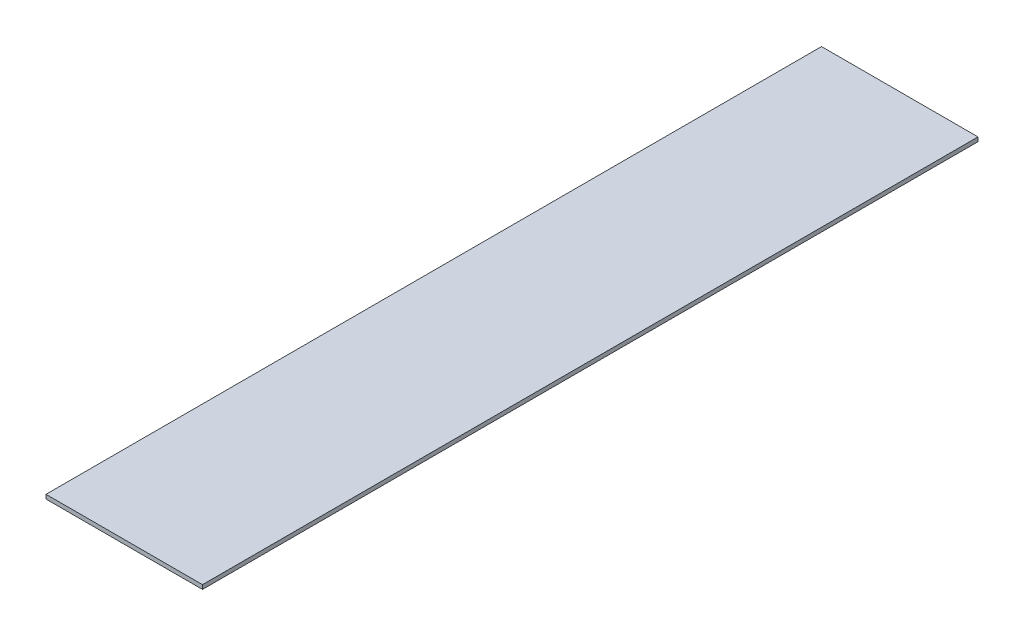
ISO-10303-21;
HEADER;
FILE_DESCRIPTION(('STEP AP214'),'2;1');
FILE_NAME('part.step','',(''),(''),'','','');
FILE_SCHEMA(('AUTOMOTIVE_DESIGN { 1 0 10303 214 1 1 1 1 }'));
ENDSEC;
DATA;
#1=APPLICATION_CONTEXT('core data for automotive mechanical design processes');
#2=APPLICATION_PROTOCOL_DEFINITION('international standard','automotive_design',2000,#1);
#3=PRODUCT_CONTEXT('',#1,'mechanical');
#4=PRODUCT('Part','Part','',(#3));
#5=PRODUCT_RELATED_PRODUCT_CATEGORY('part','',(#4));
#6=PRODUCT_DEFINITION_FORMATION('','',#4);
#7=PRODUCT_DEFINITION_CONTEXT('part definition',#1,'design');
#8=PRODUCT_DEFINITION('design','',#6,#7);
#9=PRODUCT_DEFINITION_SHAPE('','',#8);
#10=(LENGTH_UNIT() NAMED_UNIT(*) SI_UNIT(.MILLI.,.METRE.));
#11=(NAMED_UNIT(*) PLANE_ANGLE_UNIT() SI_UNIT($,.RADIAN.));
#12=(NAMED_UNIT(*) SI_UNIT($,.STERADIAN.) SOLID_ANGLE_UNIT());
#13=UNCERTAINTY_MEASURE_WITH_UNIT(LENGTH_MEASURE(1.E-05),#10,'distance_accuracy_value','');
#14=(GEOMETRIC_REPRESENTATION_CONTEXT(3) GLOBAL_UNCERTAINTY_ASSIGNED_CONTEXT((#13)) GLOBAL_UNIT_ASSIGNED_CONTEXT((#10,
#11,#12)) REPRESENTATION_CONTEXT('',''));
#15=CARTESIAN_POINT('',(0.,0.,0.));
#16=DIRECTION('',(0.,0.,1.));
#17=DIRECTION('',(1.,0.,0.));
#18=AXIS2_PLACEMENT_3D('',#15,#16,#17);
#19=CARTESIAN_POINT('',(0.,3.,0.));
#20=DIRECTION('',(1.,0.,0.));
#21=DIRECTION('',(0.,0.,-1.));
#22=AXIS2_PLACEMENT_3D('',#19,#20,#21);
#23=PLANE('',#22);
#24=DIRECTION('',(0.,0.,1.));
#25=VECTOR('',#24,1.);
#26=CARTESIAN_POINT('',(0.,0.,0.));
#27=LINE('',#26,#25);
#28=CARTESIAN_POINT('',(0.,0.,-560.));
#29=VERTEX_POINT('',#28);
#30=CARTESIAN_POINT('',(0.,0.,0.));
#31=VERTEX_POINT('',#30);
#32=EDGE_CURVE('E96',#29,#31,#27,.T.);
#33=ORIENTED_EDGE('',*,*,#32,.T.);
#34=DIRECTION('',(0.,-1.,0.));
#35=VECTOR('',#34,1.);
#36=CARTESIAN_POINT('',(0.,3.,0.));
#37=LINE('',#36,#35);
#38=CARTESIAN_POINT('',(0.,3.,0.));
#39=VERTEX_POINT('',#38);
#40=EDGE_CURVE('E11',#39,#31,#37,.T.);
#41=ORIENTED_EDGE('',*,*,#40,.F.);
#42=DIRECTION('',(0.,0.,1.));
#43=VECTOR('',#42,1.);
#44=CARTESIAN_POINT('',(0.,3.,0.));
#45=LINE('',#44,#43);
#46=CARTESIAN_POINT('',(0.,3.,-560.));
#47=VERTEX_POINT('',#46);
#48=EDGE_CURVE('E84',#47,#39,#45,.T.);
#49=ORIENTED_EDGE('',*,*,#48,.F.);
#50=DIRECTION('',(0.,-1.,0.));
#51=VECTOR('',#50,1.);
#52=CARTESIAN_POINT('',(0.,3.,-560.));
#53=LINE('',#52,#51);
#54=EDGE_CURVE('E92',#47,#29,#53,.T.);
#55=ORIENTED_EDGE('',*,*,#54,.T.);
#56=EDGE_LOOP('',(#33,#41,#49,#55));
#57=FACE_BOUND('',#56,.T.);
#58=ADVANCED_FACE('F33',(#57),#23,.F.);
#59=CARTESIAN_POINT('',(0.,3.,0.));
#60=DIRECTION('',(0.,0.,-1.));
#61=DIRECTION('',(-1.,0.,0.));
#62=AXIS2_PLACEMENT_3D('',#59,#60,#61);
#63=PLANE('',#62);
#64=DIRECTION('',(1.,0.,0.));
#65=VECTOR('',#64,1.);
#66=CARTESIAN_POINT('',(0.,0.,0.));
#67=LINE('',#66,#65);
#68=CARTESIAN_POINT('',(113.,0.,0.));
#69=VERTEX_POINT('',#68);
#70=EDGE_CURVE('E88',#31,#69,#67,.T.);
#71=ORIENTED_EDGE('',*,*,#70,.T.);
#72=DIRECTION('',(0.,-1.,0.));
#73=VECTOR('',#72,1.);
#74=CARTESIAN_POINT('',(113.,3.,0.));
#75=LINE('',#74,#73);
#76=CARTESIAN_POINT('',(113.,3.,0.));
#77=VERTEX_POINT('',#76);
#78=EDGE_CURVE('E41',#77,#69,#75,.T.);
#79=ORIENTED_EDGE('',*,*,#78,.F.);
#80=DIRECTION('',(1.,0.,0.));
#81=VECTOR('',#80,1.);
#82=CARTESIAN_POINT('',(0.,3.,0.));
#83=LINE('',#82,#81);
#84=EDGE_CURVE('E79',#39,#77,#83,.T.);
#85=ORIENTED_EDGE('',*,*,#84,.F.);
#86=ORIENTED_EDGE('',*,*,#40,.T.);
#87=EDGE_LOOP('',(#71,#79,#85,#86));
#88=FACE_BOUND('',#87,.T.);
#89=ADVANCED_FACE('F87',(#88),#63,.F.);
#90=CARTESIAN_POINT('',(113.,3.,0.));
#91=DIRECTION('',(-1.,0.,0.));
#92=DIRECTION('',(0.,0.,1.));
#93=AXIS2_PLACEMENT_3D('',#90,#91,#92);
#94=PLANE('',#93);
#95=DIRECTION('',(0.,0.,-1.));
#96=VECTOR('',#95,1.);
#97=CARTESIAN_POINT('',(113.,0.,0.));
#98=LINE('',#97,#96);
#99=CARTESIAN_POINT('',(113.,0.,-560.));
#100=VERTEX_POINT('',#99);
#101=EDGE_CURVE('E66',#69,#100,#98,.T.);
#102=ORIENTED_EDGE('',*,*,#101,.T.);
#103=DIRECTION('',(0.,-1.,0.));
#104=VECTOR('',#103,1.);
#105=CARTESIAN_POINT('',(113.,3.,-560.));
#106=LINE('',#105,#104);
#107=CARTESIAN_POINT('',(113.,3.,-560.));
#108=VERTEX_POINT('',#107);
#109=EDGE_CURVE('E89',#108,#100,#106,.T.);
#110=ORIENTED_EDGE('',*,*,#109,.F.);
#111=DIRECTION('',(0.,0.,-1.));
#112=VECTOR('',#111,1.);
#113=CARTESIAN_POINT('',(113.,3.,0.));
#114=LINE('',#113,#112);
#115=EDGE_CURVE('E82',#77,#108,#114,.T.);
#116=ORIENTED_EDGE('',*,*,#115,.F.);
#117=ORIENTED_EDGE('',*,*,#78,.T.);
#118=EDGE_LOOP('',(#102,#110,#116,#117));
#119=FACE_BOUND('',#118,.T.);
#120=ADVANCED_FACE('F90',(#119),#94,.F.);
#121=CARTESIAN_POINT('',(0.,3.,-560.));
#122=DIRECTION('',(0.,0.,1.));
#123=DIRECTION('',(1.,0.,0.));
#124=AXIS2_PLACEMENT_3D('',#121,#122,#123);
#125=PLANE('',#124);
#126=DIRECTION('',(-1.,0.,0.));
#127=VECTOR('',#126,1.);
#128=CARTESIAN_POINT('',(0.,0.,-560.));
#129=LINE('',#128,#127);
#130=EDGE_CURVE('E72',#100,#29,#129,.T.);
#131=ORIENTED_EDGE('',*,*,#130,.T.);
#132=ORIENTED_EDGE('',*,*,#54,.F.);
#133=DIRECTION('',(-1.,0.,0.));
#134=VECTOR('',#133,1.);
#135=CARTESIAN_POINT('',(0.,3.,-560.));
#136=LINE('',#135,#134);
#137=EDGE_CURVE('E49',#108,#47,#136,.T.);
#138=ORIENTED_EDGE('',*,*,#137,.F.);
#139=ORIENTED_EDGE('',*,*,#109,.T.);
#140=EDGE_LOOP('',(#131,#132,#138,#139));
#141=FACE_BOUND('',#140,.T.);
#142=ADVANCED_FACE('F103',(#141),#125,.F.);
#143=CARTESIAN_POINT('',(0.,3.,0.));
#144=DIRECTION('',(0.,-1.,0.));
#145=DIRECTION('',(0.,0.,-1.));
#146=AXIS2_PLACEMENT_3D('',#143,#144,#145);
#147=PLANE('',#146);
#148=ORIENTED_EDGE('',*,*,#48,.T.);
#149=ORIENTED_EDGE('',*,*,#84,.T.);
#150=ORIENTED_EDGE('',*,*,#115,.T.);
#151=ORIENTED_EDGE('',*,*,#137,.T.);
#152=EDGE_LOOP('',(#148,#149,#150,#151));
#153=FACE_BOUND('',#152,.T.);
#154=ADVANCED_FACE('F80',(#153),#147,.F.);
#155=CARTESIAN_POINT('',(0.,0.,0.));
#156=DIRECTION('',(0.,-1.,0.));
#157=DIRECTION('',(0.,0.,-1.));
#158=AXIS2_PLACEMENT_3D('',#155,#156,#157);
#159=PLANE('',#158);
#160=ORIENTED_EDGE('',*,*,#32,.F.);
#161=ORIENTED_EDGE('',*,*,#130,.F.);
#162=ORIENTED_EDGE('',*,*,#101,.F.);
#163=ORIENTED_EDGE('',*,*,#70,.F.);
#164=EDGE_LOOP('',(#160,#161,#162,#163));
#165=FACE_BOUND('',#164,.T.);
#166=ADVANCED_FACE('F106',(#165),#159,.T.);
#167=CLOSED_SHELL('',(#58,#89,#120,#142,#154,#166));
#168=MANIFOLD_SOLID_BREP('B2',#167);
#169=ADVANCED_BREP_SHAPE_REPRESENTATION('',(#18,#168),#14);
#170=SHAPE_DEFINITION_REPRESENTATION(#9,#169);
ENDSEC;
END-ISO-10303-21;
